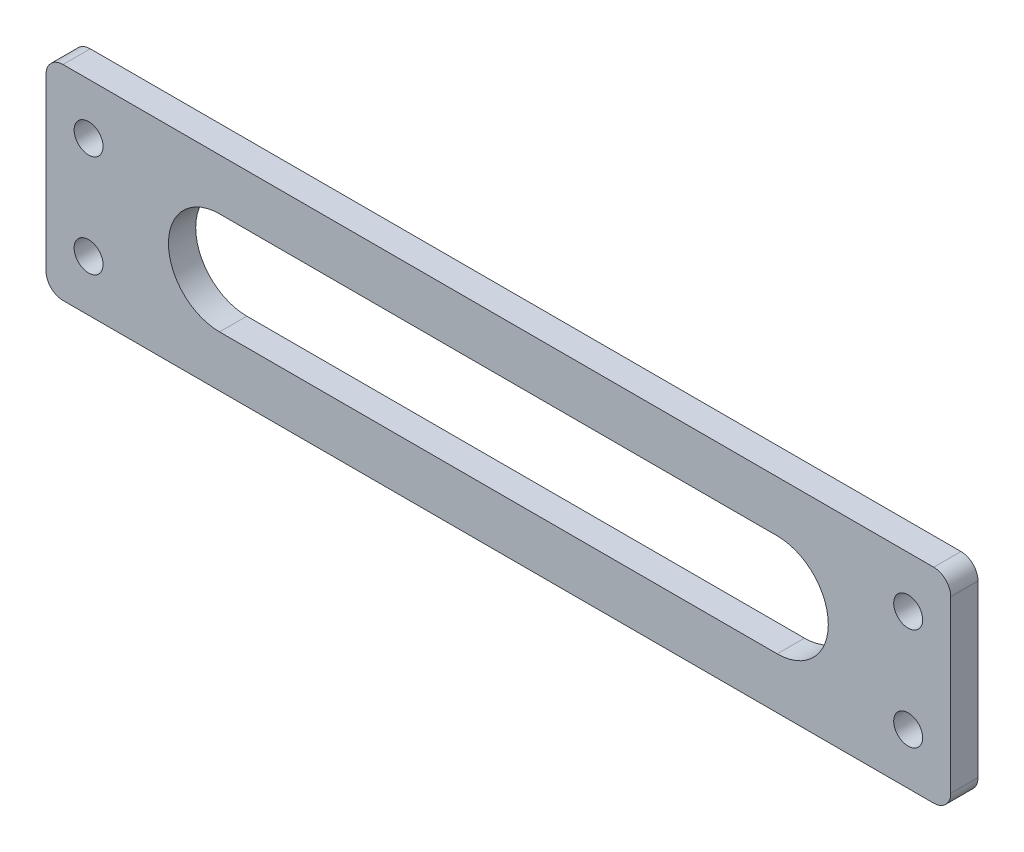
ISO-10303-21;
HEADER;
FILE_DESCRIPTION(('STEP AP214'),'2;1');
FILE_NAME('part.step','',(''),(''),'','','');
FILE_SCHEMA(('AUTOMOTIVE_DESIGN { 1 0 10303 214 1 1 1 1 }'));
ENDSEC;
DATA;
#1=APPLICATION_CONTEXT('core data for automotive mechanical design processes');
#2=APPLICATION_PROTOCOL_DEFINITION('international standard','automotive_design',2000,#1);
#3=PRODUCT_CONTEXT('',#1,'mechanical');
#4=PRODUCT('Part','Part','',(#3));
#5=PRODUCT_RELATED_PRODUCT_CATEGORY('part','',(#4));
#6=PRODUCT_DEFINITION_FORMATION('','',#4);
#7=PRODUCT_DEFINITION_CONTEXT('part definition',#1,'design');
#8=PRODUCT_DEFINITION('design','',#6,#7);
#9=PRODUCT_DEFINITION_SHAPE('','',#8);
#10=(LENGTH_UNIT() NAMED_UNIT(*) SI_UNIT(.MILLI.,.METRE.));
#11=(NAMED_UNIT(*) PLANE_ANGLE_UNIT() SI_UNIT($,.RADIAN.));
#12=(NAMED_UNIT(*) SI_UNIT($,.STERADIAN.) SOLID_ANGLE_UNIT());
#13=UNCERTAINTY_MEASURE_WITH_UNIT(LENGTH_MEASURE(1.E-05),#10,'distance_accuracy_value','');
#14=(GEOMETRIC_REPRESENTATION_CONTEXT(3) GLOBAL_UNCERTAINTY_ASSIGNED_CONTEXT((#13)) GLOBAL_UNIT_ASSIGNED_CONTEXT((#10,
#11,#12)) REPRESENTATION_CONTEXT('',''));
#15=CARTESIAN_POINT('',(0.,0.,0.));
#16=DIRECTION('',(0.,0.,1.));
#17=DIRECTION('',(1.,0.,0.));
#18=AXIS2_PLACEMENT_3D('',#15,#16,#17);
#19=CARTESIAN_POINT('',(53.12,0.,1.6));
#20=DIRECTION('',(1.,0.,0.));
#21=DIRECTION('',(0.,0.,-1.));
#22=AXIS2_PLACEMENT_3D('',#19,#20,#21);
#23=PLANE('',#22);
#24=DIRECTION('',(0.,-1.,0.));
#25=VECTOR('',#24,1.);
#26=CARTESIAN_POINT('',(53.12,0.,1.6));
#27=LINE('',#26,#25);
#28=CARTESIAN_POINT('',(53.12,-1.,1.6));
#29=VERTEX_POINT('',#28);
#30=CARTESIAN_POINT('',(53.12,-11.,1.6));
#31=VERTEX_POINT('',#30);
#32=EDGE_CURVE('E175',#29,#31,#27,.T.);
#33=ORIENTED_EDGE('',*,*,#32,.T.);
#34=DIRECTION('',(0.,0.,-1.));
#35=VECTOR('',#34,1.);
#36=CARTESIAN_POINT('',(53.12,-11.,0.));
#37=LINE('',#36,#35);
#38=CARTESIAN_POINT('',(53.12,-11.,0.));
#39=VERTEX_POINT('',#38);
#40=EDGE_CURVE('E11',#31,#39,#37,.T.);
#41=ORIENTED_EDGE('',*,*,#40,.T.);
#42=DIRECTION('',(0.,-1.,0.));
#43=VECTOR('',#42,1.);
#44=CARTESIAN_POINT('',(53.12,0.,0.));
#45=LINE('',#44,#43);
#46=CARTESIAN_POINT('',(53.12,-1.,0.));
#47=VERTEX_POINT('',#46);
#48=EDGE_CURVE('E198',#47,#39,#45,.T.);
#49=ORIENTED_EDGE('',*,*,#48,.F.);
#50=DIRECTION('',(0.,0.,-1.));
#51=VECTOR('',#50,1.);
#52=CARTESIAN_POINT('',(53.12,-1.,1.6));
#53=LINE('',#52,#51);
#54=EDGE_CURVE('E45',#47,#29,#53,.F.);
#55=ORIENTED_EDGE('',*,*,#54,.T.);
#56=EDGE_LOOP('',(#33,#41,#49,#55));
#57=FACE_BOUND('',#56,.T.);
#58=ADVANCED_FACE('F37',(#57),#23,.T.);
#59=CARTESIAN_POINT('',(0.,0.,1.6));
#60=DIRECTION('',(0.,1.,0.));
#61=DIRECTION('',(0.,0.,1.));
#62=AXIS2_PLACEMENT_3D('',#59,#60,#61);
#63=PLANE('',#62);
#64=DIRECTION('',(1.,0.,0.));
#65=VECTOR('',#64,1.);
#66=CARTESIAN_POINT('',(0.,0.,0.));
#67=LINE('',#66,#65);
#68=CARTESIAN_POINT('',(1.,0.,0.));
#69=VERTEX_POINT('',#68);
#70=CARTESIAN_POINT('',(52.12,0.,0.));
#71=VERTEX_POINT('',#70);
#72=EDGE_CURVE('E201',#69,#71,#67,.T.);
#73=ORIENTED_EDGE('',*,*,#72,.F.);
#74=DIRECTION('',(0.,0.,-1.));
#75=VECTOR('',#74,1.);
#76=CARTESIAN_POINT('',(1.,0.,1.6));
#77=LINE('',#76,#75);
#78=CARTESIAN_POINT('',(1.,0.,1.6));
#79=VERTEX_POINT('',#78);
#80=EDGE_CURVE('E232',#69,#79,#77,.F.);
#81=ORIENTED_EDGE('',*,*,#80,.T.);
#82=DIRECTION('',(1.,0.,0.));
#83=VECTOR('',#82,1.);
#84=CARTESIAN_POINT('',(0.,0.,1.6));
#85=LINE('',#84,#83);
#86=CARTESIAN_POINT('',(52.12,0.,1.6));
#87=VERTEX_POINT('',#86);
#88=EDGE_CURVE('E179',#79,#87,#85,.T.);
#89=ORIENTED_EDGE('',*,*,#88,.T.);
#90=DIRECTION('',(0.,0.,-1.));
#91=VECTOR('',#90,1.);
#92=CARTESIAN_POINT('',(52.12,0.,1.6));
#93=LINE('',#92,#91);
#94=EDGE_CURVE('E229',#87,#71,#93,.T.);
#95=ORIENTED_EDGE('',*,*,#94,.T.);
#96=EDGE_LOOP('',(#73,#81,#89,#95));
#97=FACE_BOUND('',#96,.T.);
#98=ADVANCED_FACE('F257',(#97),#63,.T.);
#99=CARTESIAN_POINT('',(0.,0.,1.6));
#100=DIRECTION('',(1.,0.,0.));
#101=DIRECTION('',(0.,1.,0.));
#102=AXIS2_PLACEMENT_3D('',#99,#100,#101);
#103=PLANE('',#102);
#104=DIRECTION('',(0.,-1.,0.));
#105=VECTOR('',#104,1.);
#106=CARTESIAN_POINT('',(0.,0.,1.6));
#107=LINE('',#106,#105);
#108=CARTESIAN_POINT('',(0.,-1.,1.6));
#109=VERTEX_POINT('',#108);
#110=CARTESIAN_POINT('',(0.,-11.,1.6));
#111=VERTEX_POINT('',#110);
#112=EDGE_CURVE('E182',#109,#111,#107,.T.);
#113=ORIENTED_EDGE('',*,*,#112,.F.);
#114=DIRECTION('',(0.,0.,-1.));
#115=VECTOR('',#114,1.);
#116=CARTESIAN_POINT('',(0.,-1.,0.));
#117=LINE('',#116,#115);
#118=CARTESIAN_POINT('',(0.,-1.,0.));
#119=VERTEX_POINT('',#118);
#120=EDGE_CURVE('E218',#109,#119,#117,.T.);
#121=ORIENTED_EDGE('',*,*,#120,.T.);
#122=DIRECTION('',(0.,-1.,0.));
#123=VECTOR('',#122,1.);
#124=CARTESIAN_POINT('',(0.,0.,0.));
#125=LINE('',#124,#123);
#126=CARTESIAN_POINT('',(0.,-11.,0.));
#127=VERTEX_POINT('',#126);
#128=EDGE_CURVE('E204',#119,#127,#125,.T.);
#129=ORIENTED_EDGE('',*,*,#128,.T.);
#130=DIRECTION('',(0.,0.,-1.));
#131=VECTOR('',#130,1.);
#132=CARTESIAN_POINT('',(0.,-11.,1.6));
#133=LINE('',#132,#131);
#134=EDGE_CURVE('E195',#127,#111,#133,.F.);
#135=ORIENTED_EDGE('',*,*,#134,.T.);
#136=EDGE_LOOP('',(#113,#121,#129,#135));
#137=FACE_BOUND('',#136,.T.);
#138=ADVANCED_FACE('F269',(#137),#103,.F.);
#139=CARTESIAN_POINT('',(2.5,-9.,1.6));
#140=DIRECTION('',(0.,0.,-1.));
#141=DIRECTION('',(-1.,0.,0.));
#142=AXIS2_PLACEMENT_3D('',#139,#140,#141);
#143=CYLINDRICAL_SURFACE('',#142,0.85);
#144=CARTESIAN_POINT('',(2.5,-9.,1.6));
#145=DIRECTION('',(0.,0.,1.));
#146=DIRECTION('',(1.,0.,0.));
#147=AXIS2_PLACEMENT_3D('',#144,#145,#146);
#148=CIRCLE('',#147,0.85);
#149=CARTESIAN_POINT('',(3.35,-9.,1.6));
#150=VERTEX_POINT('',#149);
#151=EDGE_CURVE('E189',#150,#150,#148,.T.);
#152=ORIENTED_EDGE('',*,*,#151,.T.);
#153=EDGE_LOOP('',(#152));
#154=FACE_BOUND('',#153,.T.);
#155=CARTESIAN_POINT('',(2.5,-9.,0.));
#156=DIRECTION('',(0.,0.,1.));
#157=DIRECTION('',(1.,0.,0.));
#158=AXIS2_PLACEMENT_3D('',#155,#156,#157);
#159=CIRCLE('',#158,0.85);
#160=CARTESIAN_POINT('',(3.35,-9.,0.));
#161=VERTEX_POINT('',#160);
#162=EDGE_CURVE('E212',#161,#161,#159,.T.);
#163=ORIENTED_EDGE('',*,*,#162,.F.);
#164=EDGE_LOOP('',(#163));
#165=FACE_BOUND('',#164,.T.);
#166=ADVANCED_FACE('F321',(#154,#165),#143,.F.);
#167=CARTESIAN_POINT('',(50.62,-3.,1.6));
#168=DIRECTION('',(0.,0.,-1.));
#169=DIRECTION('',(-1.,0.,0.));
#170=AXIS2_PLACEMENT_3D('',#167,#168,#169);
#171=CYLINDRICAL_SURFACE('',#170,0.85);
#172=CARTESIAN_POINT('',(50.62,-3.,1.6));
#173=DIRECTION('',(0.,0.,1.));
#174=DIRECTION('',(1.,0.,0.));
#175=AXIS2_PLACEMENT_3D('',#172,#173,#174);
#176=CIRCLE('',#175,0.85);
#177=CARTESIAN_POINT('',(51.47,-3.,1.6));
#178=VERTEX_POINT('',#177);
#179=EDGE_CURVE('E186',#178,#178,#176,.F.);
#180=ORIENTED_EDGE('',*,*,#179,.F.);
#181=EDGE_LOOP('',(#180));
#182=FACE_BOUND('',#181,.T.);
#183=CARTESIAN_POINT('',(50.62,-3.,0.));
#184=DIRECTION('',(0.,0.,1.));
#185=DIRECTION('',(1.,0.,0.));
#186=AXIS2_PLACEMENT_3D('',#183,#184,#185);
#187=CIRCLE('',#186,0.85);
#188=CARTESIAN_POINT('',(51.47,-3.,0.));
#189=VERTEX_POINT('',#188);
#190=EDGE_CURVE('E209',#189,#189,#187,.F.);
#191=ORIENTED_EDGE('',*,*,#190,.T.);
#192=EDGE_LOOP('',(#191));
#193=FACE_BOUND('',#192,.T.);
#194=ADVANCED_FACE('F324',(#182,#193),#171,.F.);
#195=CARTESIAN_POINT('',(0.,-12.,1.6));
#196=DIRECTION('',(0.,1.,0.));
#197=DIRECTION('',(0.,0.,1.));
#198=AXIS2_PLACEMENT_3D('',#195,#196,#197);
#199=PLANE('',#198);
#200=DIRECTION('',(1.,0.,0.));
#201=VECTOR('',#200,1.);
#202=CARTESIAN_POINT('',(0.,-12.,1.6));
#203=LINE('',#202,#201);
#204=CARTESIAN_POINT('',(1.,-12.,1.6));
#205=VERTEX_POINT('',#204);
#206=CARTESIAN_POINT('',(52.12,-12.,1.6));
#207=VERTEX_POINT('',#206);
#208=EDGE_CURVE('E184',#205,#207,#203,.T.);
#209=ORIENTED_EDGE('',*,*,#208,.F.);
#210=DIRECTION('',(0.,0.,-1.));
#211=VECTOR('',#210,1.);
#212=CARTESIAN_POINT('',(1.,-12.,1.6));
#213=LINE('',#212,#211);
#214=CARTESIAN_POINT('',(1.,-12.,0.));
#215=VERTEX_POINT('',#214);
#216=EDGE_CURVE('E242',#205,#215,#213,.T.);
#217=ORIENTED_EDGE('',*,*,#216,.T.);
#218=DIRECTION('',(1.,0.,0.));
#219=VECTOR('',#218,1.);
#220=CARTESIAN_POINT('',(0.,-12.,0.));
#221=LINE('',#220,#219);
#222=CARTESIAN_POINT('',(52.12,-12.,0.));
#223=VERTEX_POINT('',#222);
#224=EDGE_CURVE('E207',#215,#223,#221,.T.);
#225=ORIENTED_EDGE('',*,*,#224,.T.);
#226=DIRECTION('',(0.,0.,-1.));
#227=VECTOR('',#226,1.);
#228=CARTESIAN_POINT('',(52.12,-12.,1.6));
#229=LINE('',#228,#227);
#230=EDGE_CURVE('E52',#223,#207,#229,.F.);
#231=ORIENTED_EDGE('',*,*,#230,.T.);
#232=EDGE_LOOP('',(#209,#217,#225,#231));
#233=FACE_BOUND('',#232,.T.);
#234=ADVANCED_FACE('F275',(#233),#199,.F.);
#235=CARTESIAN_POINT('',(50.62,-9.,1.6));
#236=DIRECTION('',(0.,0.,-1.));
#237=DIRECTION('',(-1.,0.,0.));
#238=AXIS2_PLACEMENT_3D('',#235,#236,#237);
#239=CYLINDRICAL_SURFACE('',#238,0.85);
#240=CARTESIAN_POINT('',(50.62,-9.,1.6));
#241=DIRECTION('',(0.,0.,1.));
#242=DIRECTION('',(1.,0.,0.));
#243=AXIS2_PLACEMENT_3D('',#240,#241,#242);
#244=CIRCLE('',#243,0.85);
#245=CARTESIAN_POINT('',(51.47,-9.,1.6));
#246=VERTEX_POINT('',#245);
#247=EDGE_CURVE('E172',#246,#246,#244,.F.);
#248=ORIENTED_EDGE('',*,*,#247,.F.);
#249=EDGE_LOOP('',(#248));
#250=FACE_BOUND('',#249,.T.);
#251=CARTESIAN_POINT('',(50.62,-9.,0.));
#252=DIRECTION('',(0.,0.,1.));
#253=DIRECTION('',(1.,0.,0.));
#254=AXIS2_PLACEMENT_3D('',#251,#252,#253);
#255=CIRCLE('',#254,0.85);
#256=CARTESIAN_POINT('',(51.47,-9.,0.));
#257=VERTEX_POINT('',#256);
#258=EDGE_CURVE('E168',#257,#257,#255,.F.);
#259=ORIENTED_EDGE('',*,*,#258,.T.);
#260=EDGE_LOOP('',(#259));
#261=FACE_BOUND('',#260,.T.);
#262=ADVANCED_FACE('F292',(#250,#261),#239,.F.);
#263=CARTESIAN_POINT('',(2.5,-3.,1.6));
#264=DIRECTION('',(0.,0.,-1.));
#265=DIRECTION('',(-1.,0.,0.));
#266=AXIS2_PLACEMENT_3D('',#263,#264,#265);
#267=CYLINDRICAL_SURFACE('',#266,0.85);
#268=CARTESIAN_POINT('',(2.5,-3.,1.6));
#269=DIRECTION('',(0.,0.,1.));
#270=DIRECTION('',(1.,0.,0.));
#271=AXIS2_PLACEMENT_3D('',#268,#269,#270);
#272=CIRCLE('',#271,0.85);
#273=CARTESIAN_POINT('',(3.35,-3.,1.6));
#274=VERTEX_POINT('',#273);
#275=EDGE_CURVE('E192',#274,#274,#272,.T.);
#276=ORIENTED_EDGE('',*,*,#275,.T.);
#277=EDGE_LOOP('',(#276));
#278=FACE_BOUND('',#277,.T.);
#279=CARTESIAN_POINT('',(2.5,-3.,0.));
#280=DIRECTION('',(0.,0.,1.));
#281=DIRECTION('',(1.,0.,0.));
#282=AXIS2_PLACEMENT_3D('',#279,#280,#281);
#283=CIRCLE('',#282,0.85);
#284=CARTESIAN_POINT('',(3.35,-3.,0.));
#285=VERTEX_POINT('',#284);
#286=EDGE_CURVE('E176',#285,#285,#283,.T.);
#287=ORIENTED_EDGE('',*,*,#286,.F.);
#288=EDGE_LOOP('',(#287));
#289=FACE_BOUND('',#288,.T.);
#290=ADVANCED_FACE('F295',(#278,#289),#267,.F.);
#291=CARTESIAN_POINT('',(0.,0.,1.6));
#292=DIRECTION('',(0.,0.,1.));
#293=DIRECTION('',(1.,0.,0.));
#294=AXIS2_PLACEMENT_3D('',#291,#292,#293);
#295=PLANE('',#294);
#296=CARTESIAN_POINT('',(42.9308198077239,-6.,1.6));
#297=DIRECTION('',(0.,0.,-1.));
#298=DIRECTION('',(-1.,0.,0.));
#299=AXIS2_PLACEMENT_3D('',#296,#297,#298);
#300=CIRCLE('',#299,3.);
#301=CARTESIAN_POINT('',(42.9308198077239,-3.,1.6));
#302=VERTEX_POINT('',#301);
#303=CARTESIAN_POINT('',(42.9308198077239,-9.,1.6));
#304=VERTEX_POINT('',#303);
#305=EDGE_CURVE('E132',#302,#304,#300,.T.);
#306=ORIENTED_EDGE('',*,*,#305,.T.);
#307=DIRECTION('',(-1.,0.,0.));
#308=VECTOR('',#307,1.);
#309=CARTESIAN_POINT('',(42.9308198077239,-9.,1.6));
#310=LINE('',#309,#308);
#311=CARTESIAN_POINT('',(10.1891801922761,-9.,1.6));
#312=VERTEX_POINT('',#311);
#313=EDGE_CURVE('E144',#304,#312,#310,.T.);
#314=ORIENTED_EDGE('',*,*,#313,.T.);
#315=CARTESIAN_POINT('',(10.1891801922761,-6.,1.6));
#316=DIRECTION('',(0.,0.,-1.));
#317=DIRECTION('',(-1.,0.,0.));
#318=AXIS2_PLACEMENT_3D('',#315,#316,#317);
#319=CIRCLE('',#318,3.);
#320=CARTESIAN_POINT('',(10.1891801922761,-2.99999999999999,1.6));
#321=VERTEX_POINT('',#320);
#322=EDGE_CURVE('E148',#312,#321,#319,.T.);
#323=ORIENTED_EDGE('',*,*,#322,.T.);
#324=DIRECTION('',(1.,0.,0.));
#325=VECTOR('',#324,1.);
#326=CARTESIAN_POINT('',(42.9308198077239,-3.,1.6));
#327=LINE('',#326,#325);
#328=EDGE_CURVE('E140',#321,#302,#327,.T.);
#329=ORIENTED_EDGE('',*,*,#328,.T.);
#330=EDGE_LOOP('',(#306,#314,#323,#329));
#331=FACE_BOUND('',#330,.T.);
#332=ORIENTED_EDGE('',*,*,#247,.T.);
#333=EDGE_LOOP('',(#332));
#334=FACE_BOUND('',#333,.T.);
#335=ORIENTED_EDGE('',*,*,#88,.F.);
#336=CARTESIAN_POINT('',(1.,-1.,1.6));
#337=DIRECTION('',(0.,0.,1.));
#338=DIRECTION('',(1.,0.,0.));
#339=AXIS2_PLACEMENT_3D('',#336,#337,#338);
#340=CIRCLE('',#339,1.);
#341=EDGE_CURVE('E239',#79,#109,#340,.T.);
#342=ORIENTED_EDGE('',*,*,#341,.T.);
#343=ORIENTED_EDGE('',*,*,#112,.T.);
#344=CARTESIAN_POINT('',(1.,-11.,1.6));
#345=DIRECTION('',(0.,0.,1.));
#346=DIRECTION('',(1.,0.,0.));
#347=AXIS2_PLACEMENT_3D('',#344,#345,#346);
#348=CIRCLE('',#347,1.);
#349=EDGE_CURVE('E59',#111,#205,#348,.T.);
#350=ORIENTED_EDGE('',*,*,#349,.T.);
#351=ORIENTED_EDGE('',*,*,#208,.T.);
#352=CARTESIAN_POINT('',(52.12,-11.,1.6));
#353=DIRECTION('',(0.,0.,1.));
#354=DIRECTION('',(1.,0.,0.));
#355=AXIS2_PLACEMENT_3D('',#352,#353,#354);
#356=CIRCLE('',#355,1.);
#357=EDGE_CURVE('E236',#207,#31,#356,.T.);
#358=ORIENTED_EDGE('',*,*,#357,.T.);
#359=ORIENTED_EDGE('',*,*,#32,.F.);
#360=CARTESIAN_POINT('',(52.12,-1.,1.6));
#361=DIRECTION('',(0.,0.,1.));
#362=DIRECTION('',(1.,0.,0.));
#363=AXIS2_PLACEMENT_3D('',#360,#361,#362);
#364=CIRCLE('',#363,1.);
#365=EDGE_CURVE('E234',#29,#87,#364,.T.);
#366=ORIENTED_EDGE('',*,*,#365,.T.);
#367=EDGE_LOOP('',(#335,#342,#343,#350,#351,#358,#359,#366));
#368=FACE_BOUND('',#367,.T.);
#369=ORIENTED_EDGE('',*,*,#179,.T.);
#370=EDGE_LOOP('',(#369));
#371=FACE_BOUND('',#370,.T.);
#372=ORIENTED_EDGE('',*,*,#151,.F.);
#373=EDGE_LOOP('',(#372));
#374=FACE_BOUND('',#373,.T.);
#375=ORIENTED_EDGE('',*,*,#275,.F.);
#376=EDGE_LOOP('',(#375));
#377=FACE_BOUND('',#376,.T.);
#378=ADVANCED_FACE('F150',(#331,#334,#368,#371,#374,#377),#295,.T.);
#379=CARTESIAN_POINT('',(0.,0.,0.));
#380=DIRECTION('',(0.,0.,1.));
#381=DIRECTION('',(1.,0.,0.));
#382=AXIS2_PLACEMENT_3D('',#379,#380,#381);
#383=PLANE('',#382);
#384=DIRECTION('',(-1.,0.,0.));
#385=VECTOR('',#384,1.);
#386=CARTESIAN_POINT('',(42.9308198077239,-9.,0.));
#387=LINE('',#386,#385);
#388=CARTESIAN_POINT('',(42.9308198077239,-9.,0.));
#389=VERTEX_POINT('',#388);
#390=CARTESIAN_POINT('',(10.1891801922761,-9.,0.));
#391=VERTEX_POINT('',#390);
#392=EDGE_CURVE('E162',#389,#391,#387,.T.);
#393=ORIENTED_EDGE('',*,*,#392,.F.);
#394=CARTESIAN_POINT('',(42.9308198077239,-6.,0.));
#395=DIRECTION('',(0.,0.,-1.));
#396=DIRECTION('',(-1.,0.,0.));
#397=AXIS2_PLACEMENT_3D('',#394,#395,#396);
#398=CIRCLE('',#397,3.);
#399=CARTESIAN_POINT('',(42.9308198077239,-3.,0.));
#400=VERTEX_POINT('',#399);
#401=EDGE_CURVE('E135',#400,#389,#398,.T.);
#402=ORIENTED_EDGE('',*,*,#401,.F.);
#403=DIRECTION('',(1.,0.,0.));
#404=VECTOR('',#403,1.);
#405=CARTESIAN_POINT('',(42.9308198077239,-3.,0.));
#406=LINE('',#405,#404);
#407=CARTESIAN_POINT('',(10.1891801922761,-2.99999999999999,0.));
#408=VERTEX_POINT('',#407);
#409=EDGE_CURVE('E153',#408,#400,#406,.T.);
#410=ORIENTED_EDGE('',*,*,#409,.F.);
#411=CARTESIAN_POINT('',(10.1891801922761,-6.,0.));
#412=DIRECTION('',(0.,0.,-1.));
#413=DIRECTION('',(-1.,0.,0.));
#414=AXIS2_PLACEMENT_3D('',#411,#412,#413);
#415=CIRCLE('',#414,3.);
#416=EDGE_CURVE('E156',#391,#408,#415,.T.);
#417=ORIENTED_EDGE('',*,*,#416,.F.);
#418=EDGE_LOOP('',(#393,#402,#410,#417));
#419=FACE_BOUND('',#418,.T.);
#420=ORIENTED_EDGE('',*,*,#258,.F.);
#421=EDGE_LOOP('',(#420));
#422=FACE_BOUND('',#421,.T.);
#423=ORIENTED_EDGE('',*,*,#128,.F.);
#424=CARTESIAN_POINT('',(1.,-1.,0.));
#425=DIRECTION('',(0.,0.,1.));
#426=DIRECTION('',(1.,0.,0.));
#427=AXIS2_PLACEMENT_3D('',#424,#425,#426);
#428=CIRCLE('',#427,1.);
#429=EDGE_CURVE('E227',#119,#69,#428,.F.);
#430=ORIENTED_EDGE('',*,*,#429,.T.);
#431=ORIENTED_EDGE('',*,*,#72,.T.);
#432=CARTESIAN_POINT('',(52.12,-1.,0.));
#433=DIRECTION('',(0.,0.,1.));
#434=DIRECTION('',(1.,0.,0.));
#435=AXIS2_PLACEMENT_3D('',#432,#433,#434);
#436=CIRCLE('',#435,1.);
#437=EDGE_CURVE('E221',#71,#47,#436,.F.);
#438=ORIENTED_EDGE('',*,*,#437,.T.);
#439=ORIENTED_EDGE('',*,*,#48,.T.);
#440=CARTESIAN_POINT('',(52.12,-11.,0.));
#441=DIRECTION('',(0.,0.,1.));
#442=DIRECTION('',(1.,0.,0.));
#443=AXIS2_PLACEMENT_3D('',#440,#441,#442);
#444=CIRCLE('',#443,1.);
#445=EDGE_CURVE('E223',#39,#223,#444,.F.);
#446=ORIENTED_EDGE('',*,*,#445,.T.);
#447=ORIENTED_EDGE('',*,*,#224,.F.);
#448=CARTESIAN_POINT('',(1.,-11.,0.));
#449=DIRECTION('',(0.,0.,1.));
#450=DIRECTION('',(1.,0.,0.));
#451=AXIS2_PLACEMENT_3D('',#448,#449,#450);
#452=CIRCLE('',#451,1.);
#453=EDGE_CURVE('E225',#215,#127,#452,.F.);
#454=ORIENTED_EDGE('',*,*,#453,.T.);
#455=EDGE_LOOP('',(#423,#430,#431,#438,#439,#446,#447,#454));
#456=FACE_BOUND('',#455,.T.);
#457=ORIENTED_EDGE('',*,*,#190,.F.);
#458=EDGE_LOOP('',(#457));
#459=FACE_BOUND('',#458,.T.);
#460=ORIENTED_EDGE('',*,*,#162,.T.);
#461=EDGE_LOOP('',(#460));
#462=FACE_BOUND('',#461,.T.);
#463=ORIENTED_EDGE('',*,*,#286,.T.);
#464=EDGE_LOOP('',(#463));
#465=FACE_BOUND('',#464,.T.);
#466=ADVANCED_FACE('F261',(#419,#422,#456,#459,#462,#465),#383,.F.);
#467=CARTESIAN_POINT('',(42.9308198077239,-6.,1.6));
#468=DIRECTION('',(0.,0.,-1.));
#469=DIRECTION('',(-1.,0.,0.));
#470=AXIS2_PLACEMENT_3D('',#467,#468,#469);
#471=CYLINDRICAL_SURFACE('',#470,3.);
#472=ORIENTED_EDGE('',*,*,#401,.T.);
#473=DIRECTION('',(0.,0.,-1.));
#474=VECTOR('',#473,1.);
#475=CARTESIAN_POINT('',(42.9308198077239,-9.,1.6));
#476=LINE('',#475,#474);
#477=EDGE_CURVE('E128',#304,#389,#476,.T.);
#478=ORIENTED_EDGE('',*,*,#477,.F.);
#479=ORIENTED_EDGE('',*,*,#305,.F.);
#480=DIRECTION('',(0.,0.,-1.));
#481=VECTOR('',#480,1.);
#482=CARTESIAN_POINT('',(42.9308198077239,-3.,1.6));
#483=LINE('',#482,#481);
#484=EDGE_CURVE('E166',#302,#400,#483,.T.);
#485=ORIENTED_EDGE('',*,*,#484,.T.);
#486=EDGE_LOOP('',(#472,#478,#479,#485));
#487=FACE_BOUND('',#486,.T.);
#488=ADVANCED_FACE('F130',(#487),#471,.F.);
#489=CARTESIAN_POINT('',(42.9308198077239,-3.,1.6));
#490=DIRECTION('',(0.,1.,0.));
#491=DIRECTION('',(-1.,0.,0.));
#492=AXIS2_PLACEMENT_3D('',#489,#490,#491);
#493=PLANE('',#492);
#494=ORIENTED_EDGE('',*,*,#409,.T.);
#495=ORIENTED_EDGE('',*,*,#484,.F.);
#496=ORIENTED_EDGE('',*,*,#328,.F.);
#497=DIRECTION('',(0.,0.,-1.));
#498=VECTOR('',#497,1.);
#499=CARTESIAN_POINT('',(10.1891801922761,-2.99999999999999,1.6));
#500=LINE('',#499,#498);
#501=EDGE_CURVE('E169',#321,#408,#500,.T.);
#502=ORIENTED_EDGE('',*,*,#501,.T.);
#503=EDGE_LOOP('',(#494,#495,#496,#502));
#504=FACE_BOUND('',#503,.T.);
#505=ADVANCED_FACE('F306',(#504),#493,.F.);
#506=CARTESIAN_POINT('',(10.1891801922761,-6.,1.6));
#507=DIRECTION('',(0.,0.,-1.));
#508=DIRECTION('',(-1.,0.,0.));
#509=AXIS2_PLACEMENT_3D('',#506,#507,#508);
#510=CYLINDRICAL_SURFACE('',#509,3.);
#511=ORIENTED_EDGE('',*,*,#416,.T.);
#512=ORIENTED_EDGE('',*,*,#501,.F.);
#513=ORIENTED_EDGE('',*,*,#322,.F.);
#514=DIRECTION('',(0.,0.,-1.));
#515=VECTOR('',#514,1.);
#516=CARTESIAN_POINT('',(10.1891801922761,-9.,1.6));
#517=LINE('',#516,#515);
#518=EDGE_CURVE('E139',#312,#391,#517,.T.);
#519=ORIENTED_EDGE('',*,*,#518,.T.);
#520=EDGE_LOOP('',(#511,#512,#513,#519));
#521=FACE_BOUND('',#520,.T.);
#522=ADVANCED_FACE('F301',(#521),#510,.F.);
#523=CARTESIAN_POINT('',(42.9308198077239,-9.,1.6));
#524=DIRECTION('',(0.,-1.,0.));
#525=DIRECTION('',(1.,0.,0.));
#526=AXIS2_PLACEMENT_3D('',#523,#524,#525);
#527=PLANE('',#526);
#528=ORIENTED_EDGE('',*,*,#392,.T.);
#529=ORIENTED_EDGE('',*,*,#518,.F.);
#530=ORIENTED_EDGE('',*,*,#313,.F.);
#531=ORIENTED_EDGE('',*,*,#477,.T.);
#532=EDGE_LOOP('',(#528,#529,#530,#531));
#533=FACE_BOUND('',#532,.T.);
#534=ADVANCED_FACE('F145',(#533),#527,.F.);
#535=CARTESIAN_POINT('',(1.,-1.,1.6));
#536=DIRECTION('',(0.,0.,1.));
#537=DIRECTION('',(1.,0.,0.));
#538=AXIS2_PLACEMENT_3D('',#535,#536,#537);
#539=CYLINDRICAL_SURFACE('',#538,1.);
#540=ORIENTED_EDGE('',*,*,#341,.F.);
#541=ORIENTED_EDGE('',*,*,#80,.F.);
#542=ORIENTED_EDGE('',*,*,#429,.F.);
#543=ORIENTED_EDGE('',*,*,#120,.F.);
#544=EDGE_LOOP('',(#540,#541,#542,#543));
#545=FACE_BOUND('',#544,.T.);
#546=ADVANCED_FACE('F266',(#545),#539,.T.);
#547=CARTESIAN_POINT('',(1.,-11.,1.6));
#548=DIRECTION('',(0.,0.,-1.));
#549=DIRECTION('',(-1.,0.,0.));
#550=AXIS2_PLACEMENT_3D('',#547,#548,#549);
#551=CYLINDRICAL_SURFACE('',#550,1.);
#552=ORIENTED_EDGE('',*,*,#349,.F.);
#553=ORIENTED_EDGE('',*,*,#134,.F.);
#554=ORIENTED_EDGE('',*,*,#453,.F.);
#555=ORIENTED_EDGE('',*,*,#216,.F.);
#556=EDGE_LOOP('',(#552,#553,#554,#555));
#557=FACE_BOUND('',#556,.T.);
#558=ADVANCED_FACE('F273',(#557),#551,.T.);
#559=CARTESIAN_POINT('',(52.12,-11.,1.6));
#560=DIRECTION('',(0.,0.,1.));
#561=DIRECTION('',(1.,0.,0.));
#562=AXIS2_PLACEMENT_3D('',#559,#560,#561);
#563=CYLINDRICAL_SURFACE('',#562,1.);
#564=ORIENTED_EDGE('',*,*,#357,.F.);
#565=ORIENTED_EDGE('',*,*,#230,.F.);
#566=ORIENTED_EDGE('',*,*,#445,.F.);
#567=ORIENTED_EDGE('',*,*,#40,.F.);
#568=EDGE_LOOP('',(#564,#565,#566,#567));
#569=FACE_BOUND('',#568,.T.);
#570=ADVANCED_FACE('F277',(#569),#563,.T.);
#571=CARTESIAN_POINT('',(52.12,-1.,1.6));
#572=DIRECTION('',(0.,0.,-1.));
#573=DIRECTION('',(-1.,0.,0.));
#574=AXIS2_PLACEMENT_3D('',#571,#572,#573);
#575=CYLINDRICAL_SURFACE('',#574,1.);
#576=ORIENTED_EDGE('',*,*,#365,.F.);
#577=ORIENTED_EDGE('',*,*,#54,.F.);
#578=ORIENTED_EDGE('',*,*,#437,.F.);
#579=ORIENTED_EDGE('',*,*,#94,.F.);
#580=EDGE_LOOP('',(#576,#577,#578,#579));
#581=FACE_BOUND('',#580,.T.);
#582=ADVANCED_FACE('F39',(#581),#575,.T.);
#583=CLOSED_SHELL('',(#58,#98,#138,#166,#194,#234,#262,#290,#378,#466,#488,#505,#522,#534,#546,
#558,#570,#582));
#584=MANIFOLD_SOLID_BREP('B2',#583);
#585=ADVANCED_BREP_SHAPE_REPRESENTATION('',(#18,#584),#14);
#586=SHAPE_DEFINITION_REPRESENTATION(#9,#585);
ENDSEC;
END-ISO-10303-21;
